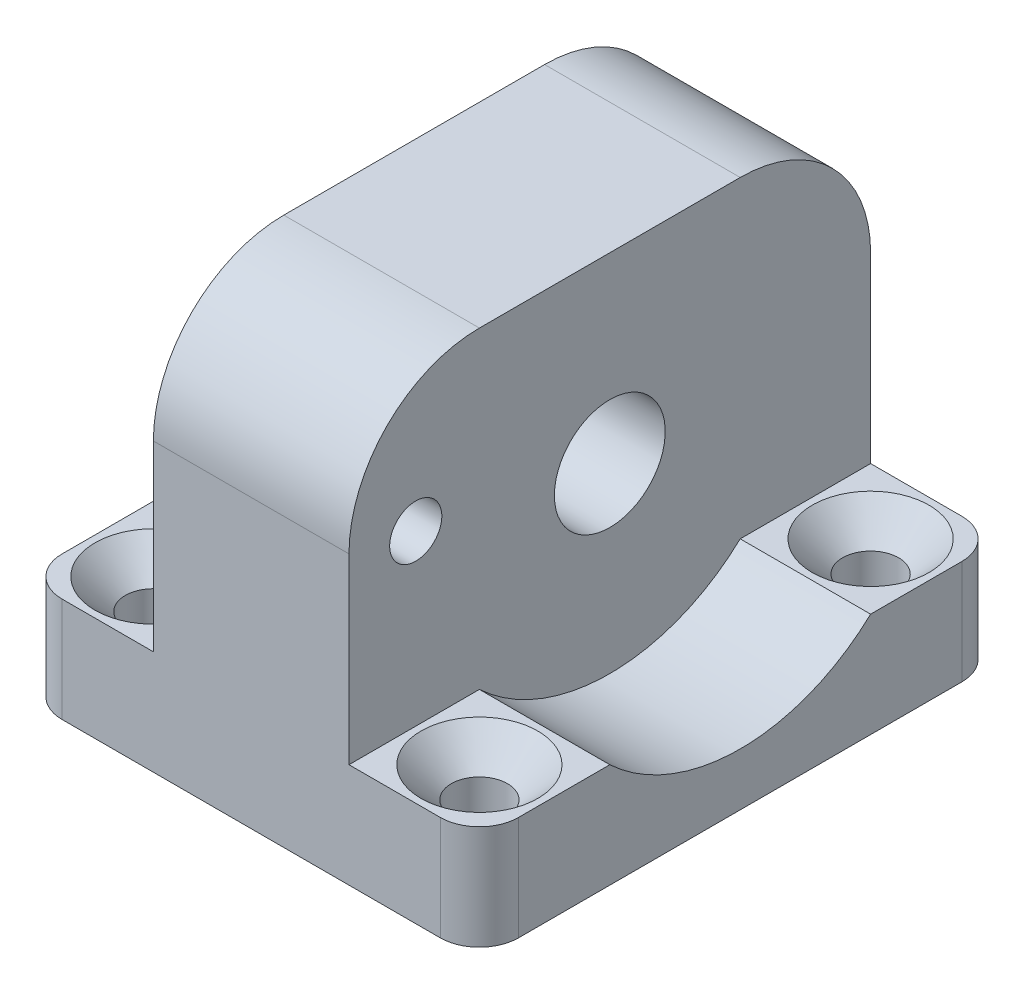
ISO-10303-21;
HEADER;
FILE_DESCRIPTION(('STEP AP214'),'2;1');
FILE_NAME('part.step','',(''),(''),'','','');
FILE_SCHEMA(('AUTOMOTIVE_DESIGN { 1 0 10303 214 1 1 1 1 }'));
ENDSEC;
DATA;
#1=APPLICATION_CONTEXT('core data for automotive mechanical design processes');
#2=APPLICATION_PROTOCOL_DEFINITION('international standard','automotive_design',2000,#1);
#3=PRODUCT_CONTEXT('',#1,'mechanical');
#4=PRODUCT('Part','Part','',(#3));
#5=PRODUCT_RELATED_PRODUCT_CATEGORY('part','',(#4));
#6=PRODUCT_DEFINITION_FORMATION('','',#4);
#7=PRODUCT_DEFINITION_CONTEXT('part definition',#1,'design');
#8=PRODUCT_DEFINITION('design','',#6,#7);
#9=PRODUCT_DEFINITION_SHAPE('','',#8);
#10=(LENGTH_UNIT() NAMED_UNIT(*) SI_UNIT(.MILLI.,.METRE.));
#11=(NAMED_UNIT(*) PLANE_ANGLE_UNIT() SI_UNIT($,.RADIAN.));
#12=(NAMED_UNIT(*) SI_UNIT($,.STERADIAN.) SOLID_ANGLE_UNIT());
#13=UNCERTAINTY_MEASURE_WITH_UNIT(LENGTH_MEASURE(1.E-05),#10,'distance_accuracy_value','');
#14=(GEOMETRIC_REPRESENTATION_CONTEXT(3) GLOBAL_UNCERTAINTY_ASSIGNED_CONTEXT((#13)) GLOBAL_UNIT_ASSIGNED_CONTEXT((#10,
#11,#12)) REPRESENTATION_CONTEXT('',''));
#15=CARTESIAN_POINT('',(0.,0.,0.));
#16=DIRECTION('',(0.,0.,1.));
#17=DIRECTION('',(1.,0.,0.));
#18=AXIS2_PLACEMENT_3D('',#15,#16,#17);
#19=CARTESIAN_POINT('',(0.,8.,0.));
#20=DIRECTION('',(0.,1.,0.));
#21=DIRECTION('',(0.,0.,1.));
#22=AXIS2_PLACEMENT_3D('',#19,#20,#21);
#23=PLANE('',#22);
#24=CARTESIAN_POINT('',(12.5,8.,15.));
#25=DIRECTION('',(0.,1.,0.));
#26=DIRECTION('',(0.,0.,1.));
#27=AXIS2_PLACEMENT_3D('',#24,#25,#26);
#28=CIRCLE('',#27,4.48);
#29=CARTESIAN_POINT('',(12.5,8.,19.48));
#30=VERTEX_POINT('',#29);
#31=EDGE_CURVE('E387',#30,#30,#28,.T.);
#32=ORIENTED_EDGE('',*,*,#31,.F.);
#33=EDGE_LOOP('',(#32));
#34=FACE_BOUND('',#33,.T.);
#35=DIRECTION('',(0.,0.,-1.));
#36=VECTOR('',#35,1.);
#37=CARTESIAN_POINT('',(17.5,8.,-20.));
#38=LINE('',#37,#36);
#39=CARTESIAN_POINT('',(17.5,8.,17.));
#40=VERTEX_POINT('',#39);
#41=CARTESIAN_POINT('',(17.5,8.,10.));
#42=VERTEX_POINT('',#41);
#43=EDGE_CURVE('E181',#40,#42,#38,.T.);
#44=ORIENTED_EDGE('',*,*,#43,.T.);
#45=DIRECTION('',(1.,0.,0.));
#46=VECTOR('',#45,1.);
#47=CARTESIAN_POINT('',(7.5,8.,10.));
#48=LINE('',#47,#46);
#49=CARTESIAN_POINT('',(7.5,8.,10.));
#50=VERTEX_POINT('',#49);
#51=EDGE_CURVE('E167',#50,#42,#48,.T.);
#52=ORIENTED_EDGE('',*,*,#51,.F.);
#53=DIRECTION('',(0.,0.,-1.));
#54=VECTOR('',#53,1.);
#55=CARTESIAN_POINT('',(7.5,8.,-20.));
#56=LINE('',#55,#54);
#57=CARTESIAN_POINT('',(7.5,8.,20.));
#58=VERTEX_POINT('',#57);
#59=EDGE_CURVE('E178',#58,#50,#56,.T.);
#60=ORIENTED_EDGE('',*,*,#59,.F.);
#61=DIRECTION('',(1.,0.,0.));
#62=VECTOR('',#61,1.);
#63=CARTESIAN_POINT('',(-17.5,8.,20.));
#64=LINE('',#63,#62);
#65=CARTESIAN_POINT('',(14.5,8.,20.));
#66=VERTEX_POINT('',#65);
#67=EDGE_CURVE('E254',#58,#66,#64,.T.);
#68=ORIENTED_EDGE('',*,*,#67,.T.);
#69=CARTESIAN_POINT('',(14.5,8.,17.));
#70=DIRECTION('',(0.,1.,0.));
#71=DIRECTION('',(0.,0.,1.));
#72=AXIS2_PLACEMENT_3D('',#69,#70,#71);
#73=CIRCLE('',#72,3.);
#74=EDGE_CURVE('E292',#66,#40,#73,.T.);
#75=ORIENTED_EDGE('',*,*,#74,.T.);
#76=EDGE_LOOP('',(#44,#52,#60,#68,#75));
#77=FACE_BOUND('',#76,.T.);
#78=ADVANCED_FACE('F40',(#34,#77),#23,.T.);
#79=CARTESIAN_POINT('',(12.5,8.,-15.));
#80=DIRECTION('',(0.,1.,0.));
#81=DIRECTION('',(0.,0.,1.));
#82=AXIS2_PLACEMENT_3D('',#79,#80,#81);
#83=CIRCLE('',#82,4.48);
#84=CARTESIAN_POINT('',(12.5,8.,-10.52));
#85=VERTEX_POINT('',#84);
#86=EDGE_CURVE('E378',#85,#85,#83,.T.);
#87=ORIENTED_EDGE('',*,*,#86,.F.);
#88=EDGE_LOOP('',(#87));
#89=FACE_BOUND('',#88,.T.);
#90=CARTESIAN_POINT('',(7.5,8.,-10.));
#91=VERTEX_POINT('',#90);
#92=CARTESIAN_POINT('',(7.5,8.,-20.));
#93=VERTEX_POINT('',#92);
#94=EDGE_CURVE('E44',#91,#93,#56,.T.);
#95=ORIENTED_EDGE('',*,*,#94,.F.);
#96=DIRECTION('',(1.,0.,0.));
#97=VECTOR('',#96,1.);
#98=CARTESIAN_POINT('',(7.5,8.,-10.));
#99=LINE('',#98,#97);
#100=CARTESIAN_POINT('',(17.5,8.,-10.));
#101=VERTEX_POINT('',#100);
#102=EDGE_CURVE('E170',#91,#101,#99,.T.);
#103=ORIENTED_EDGE('',*,*,#102,.T.);
#104=CARTESIAN_POINT('',(17.5,8.,-17.));
#105=VERTEX_POINT('',#104);
#106=EDGE_CURVE('E319',#101,#105,#38,.T.);
#107=ORIENTED_EDGE('',*,*,#106,.T.);
#108=CARTESIAN_POINT('',(14.5,8.,-17.));
#109=DIRECTION('',(0.,1.,0.));
#110=DIRECTION('',(0.,0.,1.));
#111=AXIS2_PLACEMENT_3D('',#108,#109,#110);
#112=CIRCLE('',#111,3.);
#113=CARTESIAN_POINT('',(14.5,8.,-20.));
#114=VERTEX_POINT('',#113);
#115=EDGE_CURVE('E294',#105,#114,#112,.T.);
#116=ORIENTED_EDGE('',*,*,#115,.T.);
#117=DIRECTION('',(-1.,0.,0.));
#118=VECTOR('',#117,1.);
#119=CARTESIAN_POINT('',(-17.5,8.,-20.));
#120=LINE('',#119,#118);
#121=EDGE_CURVE('E266',#114,#93,#120,.T.);
#122=ORIENTED_EDGE('',*,*,#121,.T.);
#123=EDGE_LOOP('',(#95,#103,#107,#116,#122));
#124=FACE_BOUND('',#123,.T.);
#125=ADVANCED_FACE('F335',(#89,#124),#23,.T.);
#126=CARTESIAN_POINT('',(17.5,8.,-20.));
#127=DIRECTION('',(-1.,0.,0.));
#128=DIRECTION('',(0.,0.,1.));
#129=AXIS2_PLACEMENT_3D('',#126,#127,#128);
#130=PLANE('',#129);
#131=CARTESIAN_POINT('',(17.5,18.6661430910927,0.));
#132=DIRECTION('',(-1.,0.,0.));
#133=DIRECTION('',(0.,0.,1.));
#134=AXIS2_PLACEMENT_3D('',#131,#132,#133);
#135=CIRCLE('',#134,14.6207595028324);
#136=EDGE_CURVE('E172',#101,#42,#135,.T.);
#137=ORIENTED_EDGE('',*,*,#136,.T.);
#138=ORIENTED_EDGE('',*,*,#43,.F.);
#139=DIRECTION('',(0.,-1.,0.));
#140=VECTOR('',#139,1.);
#141=CARTESIAN_POINT('',(17.5,8.,17.));
#142=LINE('',#141,#140);
#143=CARTESIAN_POINT('',(17.5,0.,17.));
#144=VERTEX_POINT('',#143);
#145=EDGE_CURVE('E286',#40,#144,#142,.T.);
#146=ORIENTED_EDGE('',*,*,#145,.T.);
#147=DIRECTION('',(0.,0.,-1.));
#148=VECTOR('',#147,1.);
#149=CARTESIAN_POINT('',(17.5,0.,-20.));
#150=LINE('',#149,#148);
#151=CARTESIAN_POINT('',(17.5,0.,-17.));
#152=VERTEX_POINT('',#151);
#153=EDGE_CURVE('E233',#144,#152,#150,.T.);
#154=ORIENTED_EDGE('',*,*,#153,.T.);
#155=DIRECTION('',(0.,-1.,0.));
#156=VECTOR('',#155,1.);
#157=CARTESIAN_POINT('',(17.5,8.,-17.));
#158=LINE('',#157,#156);
#159=EDGE_CURVE('E289',#152,#105,#158,.F.);
#160=ORIENTED_EDGE('',*,*,#159,.T.);
#161=ORIENTED_EDGE('',*,*,#106,.F.);
#162=EDGE_LOOP('',(#137,#138,#146,#154,#160,#161));
#163=FACE_BOUND('',#162,.T.);
#164=ADVANCED_FACE('F326',(#163),#130,.F.);
#165=DIRECTION('',(-1.,0.,0.));
#166=VECTOR('',#165,1.);
#167=CARTESIAN_POINT('',(-7.5,8.,-10.));
#168=LINE('',#167,#166);
#169=CARTESIAN_POINT('',(-7.5,8.,-10.));
#170=VERTEX_POINT('',#169);
#171=CARTESIAN_POINT('',(-17.5,8.,-10.));
#172=VERTEX_POINT('',#171);
#173=EDGE_CURVE('E393',#170,#172,#168,.T.);
#174=ORIENTED_EDGE('',*,*,#173,.F.);
#175=DIRECTION('',(0.,0.,1.));
#176=VECTOR('',#175,1.);
#177=CARTESIAN_POINT('',(-7.5,8.,-20.));
#178=LINE('',#177,#176);
#179=CARTESIAN_POINT('',(-7.5,8.,-20.));
#180=VERTEX_POINT('',#179);
#181=EDGE_CURVE('E190',#180,#170,#178,.T.);
#182=ORIENTED_EDGE('',*,*,#181,.F.);
#183=CARTESIAN_POINT('',(-14.5,8.,-20.));
#184=VERTEX_POINT('',#183);
#185=EDGE_CURVE('E263',#180,#184,#120,.T.);
#186=ORIENTED_EDGE('',*,*,#185,.T.);
#187=CARTESIAN_POINT('',(-14.5,8.,-17.));
#188=DIRECTION('',(0.,1.,0.));
#189=DIRECTION('',(0.,0.,1.));
#190=AXIS2_PLACEMENT_3D('',#187,#188,#189);
#191=CIRCLE('',#190,3.);
#192=CARTESIAN_POINT('',(-17.5,8.,-17.));
#193=VERTEX_POINT('',#192);
#194=EDGE_CURVE('E244',#184,#193,#191,.T.);
#195=ORIENTED_EDGE('',*,*,#194,.T.);
#196=DIRECTION('',(0.,0.,1.));
#197=VECTOR('',#196,1.);
#198=CARTESIAN_POINT('',(-17.5,8.,-20.));
#199=LINE('',#198,#197);
#200=EDGE_CURVE('E259',#193,#172,#199,.T.);
#201=ORIENTED_EDGE('',*,*,#200,.T.);
#202=EDGE_LOOP('',(#174,#182,#186,#195,#201));
#203=FACE_BOUND('',#202,.T.);
#204=CARTESIAN_POINT('',(-12.5,8.,-15.));
#205=DIRECTION('',(0.,1.,0.));
#206=DIRECTION('',(0.,0.,1.));
#207=AXIS2_PLACEMENT_3D('',#204,#205,#206);
#208=CIRCLE('',#207,4.48);
#209=CARTESIAN_POINT('',(-12.5,8.,-10.52));
#210=VERTEX_POINT('',#209);
#211=EDGE_CURVE('E369',#210,#210,#208,.T.);
#212=ORIENTED_EDGE('',*,*,#211,.F.);
#213=EDGE_LOOP('',(#212));
#214=FACE_BOUND('',#213,.T.);
#215=ADVANCED_FACE('F432',(#203,#214),#23,.T.);
#216=CARTESIAN_POINT('',(-17.5,8.,-20.));
#217=DIRECTION('',(0.,0.,1.));
#218=DIRECTION('',(1.,0.,0.));
#219=AXIS2_PLACEMENT_3D('',#216,#217,#218);
#220=PLANE('',#219);
#221=DIRECTION('',(0.,-1.,0.));
#222=VECTOR('',#221,1.);
#223=CARTESIAN_POINT('',(-7.5,32.,-20.));
#224=LINE('',#223,#222);
#225=CARTESIAN_POINT('',(-7.5,22.,-20.));
#226=VERTEX_POINT('',#225);
#227=EDGE_CURVE('E216',#226,#180,#224,.T.);
#228=ORIENTED_EDGE('',*,*,#227,.F.);
#229=DIRECTION('',(-1.,0.,0.));
#230=VECTOR('',#229,1.);
#231=CARTESIAN_POINT('',(7.5,22.,-20.));
#232=LINE('',#231,#230);
#233=CARTESIAN_POINT('',(7.5,22.,-20.));
#234=VERTEX_POINT('',#233);
#235=EDGE_CURVE('E11',#226,#234,#232,.F.);
#236=ORIENTED_EDGE('',*,*,#235,.T.);
#237=DIRECTION('',(0.,-1.,0.));
#238=VECTOR('',#237,1.);
#239=CARTESIAN_POINT('',(7.5,32.,-20.));
#240=LINE('',#239,#238);
#241=EDGE_CURVE('E218',#234,#93,#240,.T.);
#242=ORIENTED_EDGE('',*,*,#241,.T.);
#243=ORIENTED_EDGE('',*,*,#121,.F.);
#244=DIRECTION('',(0.,-1.,0.));
#245=VECTOR('',#244,1.);
#246=CARTESIAN_POINT('',(14.5,8.,-20.));
#247=LINE('',#246,#245);
#248=CARTESIAN_POINT('',(14.5,0.,-20.));
#249=VERTEX_POINT('',#248);
#250=EDGE_CURVE('E275',#114,#249,#247,.T.);
#251=ORIENTED_EDGE('',*,*,#250,.T.);
#252=DIRECTION('',(-1.,0.,0.));
#253=VECTOR('',#252,1.);
#254=CARTESIAN_POINT('',(-17.5,0.,-20.));
#255=LINE('',#254,#253);
#256=CARTESIAN_POINT('',(-14.5,0.,-20.));
#257=VERTEX_POINT('',#256);
#258=EDGE_CURVE('E317',#249,#257,#255,.T.);
#259=ORIENTED_EDGE('',*,*,#258,.T.);
#260=DIRECTION('',(0.,-1.,0.));
#261=VECTOR('',#260,1.);
#262=CARTESIAN_POINT('',(-14.5,8.,-20.));
#263=LINE('',#262,#261);
#264=EDGE_CURVE('E253',#257,#184,#263,.F.);
#265=ORIENTED_EDGE('',*,*,#264,.T.);
#266=ORIENTED_EDGE('',*,*,#185,.F.);
#267=EDGE_LOOP('',(#228,#236,#242,#243,#251,#259,#265,#266));
#268=FACE_BOUND('',#267,.T.);
#269=ADVANCED_FACE('F337',(#268),#220,.F.);
#270=CARTESIAN_POINT('',(-17.5,8.,-20.));
#271=DIRECTION('',(1.,0.,0.));
#272=DIRECTION('',(0.,0.,-1.));
#273=AXIS2_PLACEMENT_3D('',#270,#271,#272);
#274=PLANE('',#273);
#275=CARTESIAN_POINT('',(-17.5,8.,10.));
#276=VERTEX_POINT('',#275);
#277=CARTESIAN_POINT('',(-17.5,8.,17.));
#278=VERTEX_POINT('',#277);
#279=EDGE_CURVE('E273',#276,#278,#199,.T.);
#280=ORIENTED_EDGE('',*,*,#279,.F.);
#281=CARTESIAN_POINT('',(-17.5,18.6661430910927,0.));
#282=DIRECTION('',(-1.,0.,0.));
#283=DIRECTION('',(0.,0.,1.));
#284=AXIS2_PLACEMENT_3D('',#281,#282,#283);
#285=CIRCLE('',#284,14.6207595028324);
#286=EDGE_CURVE('E182',#172,#276,#285,.T.);
#287=ORIENTED_EDGE('',*,*,#286,.F.);
#288=ORIENTED_EDGE('',*,*,#200,.F.);
#289=DIRECTION('',(0.,-1.,0.));
#290=VECTOR('',#289,1.);
#291=CARTESIAN_POINT('',(-17.5,8.,-17.));
#292=LINE('',#291,#290);
#293=CARTESIAN_POINT('',(-17.5,0.,-17.));
#294=VERTEX_POINT('',#293);
#295=EDGE_CURVE('E248',#193,#294,#292,.T.);
#296=ORIENTED_EDGE('',*,*,#295,.T.);
#297=DIRECTION('',(0.,0.,1.));
#298=VECTOR('',#297,1.);
#299=CARTESIAN_POINT('',(-17.5,0.,-20.));
#300=LINE('',#299,#298);
#301=CARTESIAN_POINT('',(-17.5,0.,17.));
#302=VERTEX_POINT('',#301);
#303=EDGE_CURVE('E307',#294,#302,#300,.T.);
#304=ORIENTED_EDGE('',*,*,#303,.T.);
#305=DIRECTION('',(0.,-1.,0.));
#306=VECTOR('',#305,1.);
#307=CARTESIAN_POINT('',(-17.5,8.,17.));
#308=LINE('',#307,#306);
#309=EDGE_CURVE('E295',#302,#278,#308,.F.);
#310=ORIENTED_EDGE('',*,*,#309,.T.);
#311=EDGE_LOOP('',(#280,#287,#288,#296,#304,#310));
#312=FACE_BOUND('',#311,.T.);
#313=ADVANCED_FACE('F306',(#312),#274,.F.);
#314=CARTESIAN_POINT('',(-17.5,8.,20.));
#315=DIRECTION('',(0.,0.,-1.));
#316=DIRECTION('',(-1.,0.,0.));
#317=AXIS2_PLACEMENT_3D('',#314,#315,#316);
#318=PLANE('',#317);
#319=DIRECTION('',(0.,-1.,0.));
#320=VECTOR('',#319,1.);
#321=CARTESIAN_POINT('',(7.5,32.,20.));
#322=LINE('',#321,#320);
#323=CARTESIAN_POINT('',(7.5,22.,20.));
#324=VERTEX_POINT('',#323);
#325=EDGE_CURVE('E187',#324,#58,#322,.T.);
#326=ORIENTED_EDGE('',*,*,#325,.F.);
#327=DIRECTION('',(1.,0.,0.));
#328=VECTOR('',#327,1.);
#329=CARTESIAN_POINT('',(-7.5,22.,20.));
#330=LINE('',#329,#328);
#331=CARTESIAN_POINT('',(-7.5,22.,20.));
#332=VERTEX_POINT('',#331);
#333=EDGE_CURVE('E215',#324,#332,#330,.F.);
#334=ORIENTED_EDGE('',*,*,#333,.T.);
#335=DIRECTION('',(0.,-1.,0.));
#336=VECTOR('',#335,1.);
#337=CARTESIAN_POINT('',(-7.5,32.,20.));
#338=LINE('',#337,#336);
#339=CARTESIAN_POINT('',(-7.5,8.,20.));
#340=VERTEX_POINT('',#339);
#341=EDGE_CURVE('E219',#332,#340,#338,.T.);
#342=ORIENTED_EDGE('',*,*,#341,.T.);
#343=CARTESIAN_POINT('',(-14.5,8.,20.));
#344=VERTEX_POINT('',#343);
#345=EDGE_CURVE('E249',#344,#340,#64,.T.);
#346=ORIENTED_EDGE('',*,*,#345,.F.);
#347=DIRECTION('',(0.,-1.,0.));
#348=VECTOR('',#347,1.);
#349=CARTESIAN_POINT('',(-14.5,8.,20.));
#350=LINE('',#349,#348);
#351=CARTESIAN_POINT('',(-14.5,0.,20.));
#352=VERTEX_POINT('',#351);
#353=EDGE_CURVE('E239',#344,#352,#350,.T.);
#354=ORIENTED_EDGE('',*,*,#353,.T.);
#355=DIRECTION('',(1.,0.,0.));
#356=VECTOR('',#355,1.);
#357=CARTESIAN_POINT('',(-17.5,0.,20.));
#358=LINE('',#357,#356);
#359=CARTESIAN_POINT('',(14.5,0.,20.));
#360=VERTEX_POINT('',#359);
#361=EDGE_CURVE('E267',#352,#360,#358,.T.);
#362=ORIENTED_EDGE('',*,*,#361,.T.);
#363=DIRECTION('',(0.,-1.,0.));
#364=VECTOR('',#363,1.);
#365=CARTESIAN_POINT('',(14.5,8.,20.));
#366=LINE('',#365,#364);
#367=EDGE_CURVE('E242',#360,#66,#366,.F.);
#368=ORIENTED_EDGE('',*,*,#367,.T.);
#369=ORIENTED_EDGE('',*,*,#67,.F.);
#370=EDGE_LOOP('',(#326,#334,#342,#346,#354,#362,#368,#369));
#371=FACE_BOUND('',#370,.T.);
#372=ADVANCED_FACE('F436',(#371),#318,.F.);
#373=DIRECTION('',(-1.,0.,0.));
#374=VECTOR('',#373,1.);
#375=CARTESIAN_POINT('',(-7.5,8.,10.));
#376=LINE('',#375,#374);
#377=CARTESIAN_POINT('',(-7.5,8.,9.99999999999999));
#378=VERTEX_POINT('',#377);
#379=EDGE_CURVE('E394',#378,#276,#376,.T.);
#380=ORIENTED_EDGE('',*,*,#379,.T.);
#381=ORIENTED_EDGE('',*,*,#279,.T.);
#382=CARTESIAN_POINT('',(-14.5,8.,17.));
#383=DIRECTION('',(0.,1.,0.));
#384=DIRECTION('',(0.,0.,1.));
#385=AXIS2_PLACEMENT_3D('',#382,#383,#384);
#386=CIRCLE('',#385,3.);
#387=EDGE_CURVE('E246',#278,#344,#386,.T.);
#388=ORIENTED_EDGE('',*,*,#387,.T.);
#389=ORIENTED_EDGE('',*,*,#345,.T.);
#390=EDGE_CURVE('E188',#378,#340,#178,.T.);
#391=ORIENTED_EDGE('',*,*,#390,.F.);
#392=EDGE_LOOP('',(#380,#381,#388,#389,#391));
#393=FACE_BOUND('',#392,.T.);
#394=CARTESIAN_POINT('',(-12.5,8.,15.));
#395=DIRECTION('',(0.,1.,0.));
#396=DIRECTION('',(0.,0.,1.));
#397=AXIS2_PLACEMENT_3D('',#394,#395,#396);
#398=CIRCLE('',#397,4.48);
#399=CARTESIAN_POINT('',(-12.5,8.,19.48));
#400=VERTEX_POINT('',#399);
#401=EDGE_CURVE('E360',#400,#400,#398,.T.);
#402=ORIENTED_EDGE('',*,*,#401,.F.);
#403=EDGE_LOOP('',(#402));
#404=FACE_BOUND('',#403,.T.);
#405=ADVANCED_FACE('F427',(#393,#404),#23,.T.);
#406=CARTESIAN_POINT('',(0.,0.,0.));
#407=DIRECTION('',(0.,1.,0.));
#408=DIRECTION('',(0.,0.,1.));
#409=AXIS2_PLACEMENT_3D('',#406,#407,#408);
#410=PLANE('',#409);
#411=CARTESIAN_POINT('',(12.5,0.,15.));
#412=DIRECTION('',(0.,1.,0.));
#413=DIRECTION('',(0.,0.,1.));
#414=AXIS2_PLACEMENT_3D('',#411,#412,#413);
#415=CIRCLE('',#414,2.15);
#416=CARTESIAN_POINT('',(12.5,0.,17.15));
#417=VERTEX_POINT('',#416);
#418=EDGE_CURVE('E381',#417,#417,#415,.T.);
#419=ORIENTED_EDGE('',*,*,#418,.T.);
#420=EDGE_LOOP('',(#419));
#421=FACE_BOUND('',#420,.T.);
#422=CARTESIAN_POINT('',(12.5,0.,-15.));
#423=DIRECTION('',(0.,1.,0.));
#424=DIRECTION('',(0.,0.,1.));
#425=AXIS2_PLACEMENT_3D('',#422,#423,#424);
#426=CIRCLE('',#425,2.15);
#427=CARTESIAN_POINT('',(12.5,0.,-12.85));
#428=VERTEX_POINT('',#427);
#429=EDGE_CURVE('E372',#428,#428,#426,.T.);
#430=ORIENTED_EDGE('',*,*,#429,.T.);
#431=EDGE_LOOP('',(#430));
#432=FACE_BOUND('',#431,.T.);
#433=CARTESIAN_POINT('',(-12.5,0.,-15.));
#434=DIRECTION('',(0.,1.,0.));
#435=DIRECTION('',(0.,0.,1.));
#436=AXIS2_PLACEMENT_3D('',#433,#434,#435);
#437=CIRCLE('',#436,2.15);
#438=CARTESIAN_POINT('',(-12.5,0.,-12.85));
#439=VERTEX_POINT('',#438);
#440=EDGE_CURVE('E363',#439,#439,#437,.T.);
#441=ORIENTED_EDGE('',*,*,#440,.T.);
#442=EDGE_LOOP('',(#441));
#443=FACE_BOUND('',#442,.T.);
#444=CARTESIAN_POINT('',(-12.5,0.,15.));
#445=DIRECTION('',(0.,1.,0.));
#446=DIRECTION('',(0.,0.,1.));
#447=AXIS2_PLACEMENT_3D('',#444,#445,#446);
#448=CIRCLE('',#447,2.15);
#449=CARTESIAN_POINT('',(-12.5,0.,17.15));
#450=VERTEX_POINT('',#449);
#451=EDGE_CURVE('E191',#450,#450,#448,.T.);
#452=ORIENTED_EDGE('',*,*,#451,.T.);
#453=EDGE_LOOP('',(#452));
#454=FACE_BOUND('',#453,.T.);
#455=ORIENTED_EDGE('',*,*,#258,.F.);
#456=CARTESIAN_POINT('',(14.5,0.,-17.));
#457=DIRECTION('',(0.,1.,0.));
#458=DIRECTION('',(0.,0.,1.));
#459=AXIS2_PLACEMENT_3D('',#456,#457,#458);
#460=CIRCLE('',#459,3.);
#461=EDGE_CURVE('E284',#249,#152,#460,.F.);
#462=ORIENTED_EDGE('',*,*,#461,.T.);
#463=ORIENTED_EDGE('',*,*,#153,.F.);
#464=CARTESIAN_POINT('',(14.5,0.,17.));
#465=DIRECTION('',(0.,1.,0.));
#466=DIRECTION('',(0.,0.,1.));
#467=AXIS2_PLACEMENT_3D('',#464,#465,#466);
#468=CIRCLE('',#467,3.);
#469=EDGE_CURVE('E278',#144,#360,#468,.F.);
#470=ORIENTED_EDGE('',*,*,#469,.T.);
#471=ORIENTED_EDGE('',*,*,#361,.F.);
#472=CARTESIAN_POINT('',(-14.5,0.,17.));
#473=DIRECTION('',(0.,1.,0.));
#474=DIRECTION('',(0.,0.,1.));
#475=AXIS2_PLACEMENT_3D('',#472,#473,#474);
#476=CIRCLE('',#475,3.);
#477=EDGE_CURVE('E280',#352,#302,#476,.F.);
#478=ORIENTED_EDGE('',*,*,#477,.T.);
#479=ORIENTED_EDGE('',*,*,#303,.F.);
#480=CARTESIAN_POINT('',(-14.5,0.,-17.));
#481=DIRECTION('',(0.,1.,0.));
#482=DIRECTION('',(0.,0.,1.));
#483=AXIS2_PLACEMENT_3D('',#480,#481,#482);
#484=CIRCLE('',#483,3.);
#485=EDGE_CURVE('E282',#294,#257,#484,.F.);
#486=ORIENTED_EDGE('',*,*,#485,.T.);
#487=EDGE_LOOP('',(#455,#462,#463,#470,#471,#478,#479,#486));
#488=FACE_BOUND('',#487,.T.);
#489=ADVANCED_FACE('F314',(#421,#432,#443,#454,#488),#410,.F.);
#490=CARTESIAN_POINT('',(7.5,32.,-20.));
#491=DIRECTION('',(-1.,0.,0.));
#492=DIRECTION('',(0.,0.,1.));
#493=AXIS2_PLACEMENT_3D('',#490,#491,#492);
#494=PLANE('',#493);
#495=CARTESIAN_POINT('',(7.5,20.9575308997216,14.8830323358084));
#496=DIRECTION('',(-1.,0.,0.));
#497=DIRECTION('',(0.,0.,1.));
#498=AXIS2_PLACEMENT_3D('',#495,#496,#497);
#499=CIRCLE('',#498,2.);
#500=CARTESIAN_POINT('',(7.5,20.9575308997216,16.8830323358084));
#501=VERTEX_POINT('',#500);
#502=EDGE_CURVE('E405',#501,#501,#499,.T.);
#503=ORIENTED_EDGE('',*,*,#502,.T.);
#504=EDGE_LOOP('',(#503));
#505=FACE_BOUND('',#504,.T.);
#506=CARTESIAN_POINT('',(7.5,18.,0.));
#507=DIRECTION('',(-1.,0.,0.));
#508=DIRECTION('',(0.,0.,1.));
#509=AXIS2_PLACEMENT_3D('',#506,#507,#508);
#510=CIRCLE('',#509,4.25);
#511=CARTESIAN_POINT('',(7.5,18.,4.25));
#512=VERTEX_POINT('',#511);
#513=EDGE_CURVE('E390',#512,#512,#510,.T.);
#514=ORIENTED_EDGE('',*,*,#513,.T.);
#515=EDGE_LOOP('',(#514));
#516=FACE_BOUND('',#515,.T.);
#517=DIRECTION('',(0.,0.,-1.));
#518=VECTOR('',#517,1.);
#519=CARTESIAN_POINT('',(7.5,32.,-20.));
#520=LINE('',#519,#518);
#521=CARTESIAN_POINT('',(7.5,32.,10.));
#522=VERTEX_POINT('',#521);
#523=CARTESIAN_POINT('',(7.5,32.,-10.));
#524=VERTEX_POINT('',#523);
#525=EDGE_CURVE('E349',#522,#524,#520,.T.);
#526=ORIENTED_EDGE('',*,*,#525,.F.);
#527=CARTESIAN_POINT('',(7.5,22.,10.));
#528=DIRECTION('',(-1.,0.,0.));
#529=DIRECTION('',(0.,0.,1.));
#530=AXIS2_PLACEMENT_3D('',#527,#528,#529);
#531=CIRCLE('',#530,10.);
#532=EDGE_CURVE('E225',#522,#324,#531,.F.);
#533=ORIENTED_EDGE('',*,*,#532,.T.);
#534=ORIENTED_EDGE('',*,*,#325,.T.);
#535=ORIENTED_EDGE('',*,*,#59,.T.);
#536=CARTESIAN_POINT('',(7.5,18.6661430910927,0.));
#537=DIRECTION('',(-1.,0.,0.));
#538=DIRECTION('',(0.,0.,1.));
#539=AXIS2_PLACEMENT_3D('',#536,#537,#538);
#540=CIRCLE('',#539,14.6207595028324);
#541=EDGE_CURVE('E58',#91,#50,#540,.T.);
#542=ORIENTED_EDGE('',*,*,#541,.F.);
#543=ORIENTED_EDGE('',*,*,#94,.T.);
#544=ORIENTED_EDGE('',*,*,#241,.F.);
#545=CARTESIAN_POINT('',(7.5,22.,-9.99999999999999));
#546=DIRECTION('',(-1.,0.,0.));
#547=DIRECTION('',(0.,0.,1.));
#548=AXIS2_PLACEMENT_3D('',#545,#546,#547);
#549=CIRCLE('',#548,10.);
#550=EDGE_CURVE('E227',#234,#524,#549,.F.);
#551=ORIENTED_EDGE('',*,*,#550,.T.);
#552=EDGE_LOOP('',(#526,#533,#534,#535,#542,#543,#544,#551));
#553=FACE_BOUND('',#552,.T.);
#554=ADVANCED_FACE('F185',(#505,#516,#553),#494,.F.);
#555=CARTESIAN_POINT('',(-7.5,32.,-20.));
#556=DIRECTION('',(1.,0.,0.));
#557=DIRECTION('',(0.,0.,-1.));
#558=AXIS2_PLACEMENT_3D('',#555,#556,#557);
#559=PLANE('',#558);
#560=CARTESIAN_POINT('',(-7.5,20.9575308997216,14.8830323358084));
#561=DIRECTION('',(-1.,0.,0.));
#562=DIRECTION('',(0.,0.,1.));
#563=AXIS2_PLACEMENT_3D('',#560,#561,#562);
#564=CIRCLE('',#563,2.);
#565=CARTESIAN_POINT('',(-7.5,20.9575308997216,16.8830323358084));
#566=VERTEX_POINT('',#565);
#567=EDGE_CURVE('E408',#566,#566,#564,.T.);
#568=ORIENTED_EDGE('',*,*,#567,.F.);
#569=EDGE_LOOP('',(#568));
#570=FACE_BOUND('',#569,.T.);
#571=ORIENTED_EDGE('',*,*,#341,.F.);
#572=CARTESIAN_POINT('',(-7.5,22.,10.));
#573=DIRECTION('',(1.,0.,0.));
#574=DIRECTION('',(0.,0.,-1.));
#575=AXIS2_PLACEMENT_3D('',#572,#573,#574);
#576=CIRCLE('',#575,10.);
#577=CARTESIAN_POINT('',(-7.5,32.,10.));
#578=VERTEX_POINT('',#577);
#579=EDGE_CURVE('E50',#332,#578,#576,.F.);
#580=ORIENTED_EDGE('',*,*,#579,.T.);
#581=DIRECTION('',(0.,0.,1.));
#582=VECTOR('',#581,1.);
#583=CARTESIAN_POINT('',(-7.5,32.,-20.));
#584=LINE('',#583,#582);
#585=CARTESIAN_POINT('',(-7.5,32.,-10.));
#586=VERTEX_POINT('',#585);
#587=EDGE_CURVE('E201',#586,#578,#584,.T.);
#588=ORIENTED_EDGE('',*,*,#587,.F.);
#589=CARTESIAN_POINT('',(-7.5,22.,-9.99999999999999));
#590=DIRECTION('',(1.,0.,0.));
#591=DIRECTION('',(0.,0.,-1.));
#592=AXIS2_PLACEMENT_3D('',#589,#590,#591);
#593=CIRCLE('',#592,10.);
#594=EDGE_CURVE('E213',#586,#226,#593,.F.);
#595=ORIENTED_EDGE('',*,*,#594,.T.);
#596=ORIENTED_EDGE('',*,*,#227,.T.);
#597=ORIENTED_EDGE('',*,*,#181,.T.);
#598=CARTESIAN_POINT('',(-7.5,18.6661430910927,0.));
#599=DIRECTION('',(-1.,0.,0.));
#600=DIRECTION('',(0.,0.,1.));
#601=AXIS2_PLACEMENT_3D('',#598,#599,#600);
#602=CIRCLE('',#601,14.6207595028324);
#603=EDGE_CURVE('E66',#170,#378,#602,.T.);
#604=ORIENTED_EDGE('',*,*,#603,.T.);
#605=ORIENTED_EDGE('',*,*,#390,.T.);
#606=EDGE_LOOP('',(#571,#580,#588,#595,#596,#597,#604,#605));
#607=FACE_BOUND('',#606,.T.);
#608=CARTESIAN_POINT('',(-7.5,18.,0.));
#609=DIRECTION('',(1.,0.,0.));
#610=DIRECTION('',(0.,0.,-1.));
#611=AXIS2_PLACEMENT_3D('',#608,#609,#610);
#612=CIRCLE('',#611,4.25);
#613=CARTESIAN_POINT('',(-7.5,18.,-4.25));
#614=VERTEX_POINT('',#613);
#615=EDGE_CURVE('E401',#614,#614,#612,.T.);
#616=ORIENTED_EDGE('',*,*,#615,.T.);
#617=EDGE_LOOP('',(#616));
#618=FACE_BOUND('',#617,.T.);
#619=ADVANCED_FACE('F351',(#570,#607,#618),#559,.F.);
#620=CARTESIAN_POINT('',(0.,32.,0.));
#621=DIRECTION('',(0.,1.,0.));
#622=DIRECTION('',(0.,0.,1.));
#623=AXIS2_PLACEMENT_3D('',#620,#621,#622);
#624=PLANE('',#623);
#625=ORIENTED_EDGE('',*,*,#587,.T.);
#626=DIRECTION('',(1.,0.,0.));
#627=VECTOR('',#626,1.);
#628=CARTESIAN_POINT('',(7.5,32.,10.));
#629=LINE('',#628,#627);
#630=EDGE_CURVE('E229',#578,#522,#629,.T.);
#631=ORIENTED_EDGE('',*,*,#630,.T.);
#632=ORIENTED_EDGE('',*,*,#525,.T.);
#633=DIRECTION('',(-1.,0.,0.));
#634=VECTOR('',#633,1.);
#635=CARTESIAN_POINT('',(-7.5,32.,-9.99999999999999));
#636=LINE('',#635,#634);
#637=EDGE_CURVE('E236',#524,#586,#636,.T.);
#638=ORIENTED_EDGE('',*,*,#637,.T.);
#639=EDGE_LOOP('',(#625,#631,#632,#638));
#640=FACE_BOUND('',#639,.T.);
#641=ADVANCED_FACE('F347',(#640),#624,.T.);
#642=CARTESIAN_POINT('',(14.5,8.,-17.));
#643=DIRECTION('',(0.,-1.,0.));
#644=DIRECTION('',(0.,0.,-1.));
#645=AXIS2_PLACEMENT_3D('',#642,#643,#644);
#646=CYLINDRICAL_SURFACE('',#645,3.);
#647=ORIENTED_EDGE('',*,*,#115,.F.);
#648=ORIENTED_EDGE('',*,*,#159,.F.);
#649=ORIENTED_EDGE('',*,*,#461,.F.);
#650=ORIENTED_EDGE('',*,*,#250,.F.);
#651=EDGE_LOOP('',(#647,#648,#649,#650));
#652=FACE_BOUND('',#651,.T.);
#653=ADVANCED_FACE('F331',(#652),#646,.T.);
#654=CARTESIAN_POINT('',(-14.5,8.,-17.));
#655=DIRECTION('',(0.,-1.,0.));
#656=DIRECTION('',(0.,0.,-1.));
#657=AXIS2_PLACEMENT_3D('',#654,#655,#656);
#658=CYLINDRICAL_SURFACE('',#657,3.);
#659=ORIENTED_EDGE('',*,*,#194,.F.);
#660=ORIENTED_EDGE('',*,*,#264,.F.);
#661=ORIENTED_EDGE('',*,*,#485,.F.);
#662=ORIENTED_EDGE('',*,*,#295,.F.);
#663=EDGE_LOOP('',(#659,#660,#661,#662));
#664=FACE_BOUND('',#663,.T.);
#665=ADVANCED_FACE('F508',(#664),#658,.T.);
#666=CARTESIAN_POINT('',(-14.5,8.,17.));
#667=DIRECTION('',(0.,-1.,0.));
#668=DIRECTION('',(0.,0.,-1.));
#669=AXIS2_PLACEMENT_3D('',#666,#667,#668);
#670=CYLINDRICAL_SURFACE('',#669,3.);
#671=ORIENTED_EDGE('',*,*,#387,.F.);
#672=ORIENTED_EDGE('',*,*,#309,.F.);
#673=ORIENTED_EDGE('',*,*,#477,.F.);
#674=ORIENTED_EDGE('',*,*,#353,.F.);
#675=EDGE_LOOP('',(#671,#672,#673,#674));
#676=FACE_BOUND('',#675,.T.);
#677=ADVANCED_FACE('F502',(#676),#670,.T.);
#678=CARTESIAN_POINT('',(14.5,8.,17.));
#679=DIRECTION('',(0.,-1.,0.));
#680=DIRECTION('',(0.,0.,-1.));
#681=AXIS2_PLACEMENT_3D('',#678,#679,#680);
#682=CYLINDRICAL_SURFACE('',#681,3.);
#683=ORIENTED_EDGE('',*,*,#74,.F.);
#684=ORIENTED_EDGE('',*,*,#367,.F.);
#685=ORIENTED_EDGE('',*,*,#469,.F.);
#686=ORIENTED_EDGE('',*,*,#145,.F.);
#687=EDGE_LOOP('',(#683,#684,#685,#686));
#688=FACE_BOUND('',#687,.T.);
#689=ADVANCED_FACE('F497',(#688),#682,.T.);
#690=CARTESIAN_POINT('',(0.,22.,10.));
#691=DIRECTION('',(-1.,0.,0.));
#692=DIRECTION('',(0.,0.,1.));
#693=AXIS2_PLACEMENT_3D('',#690,#691,#692);
#694=CYLINDRICAL_SURFACE('',#693,10.);
#695=ORIENTED_EDGE('',*,*,#579,.F.);
#696=ORIENTED_EDGE('',*,*,#333,.F.);
#697=ORIENTED_EDGE('',*,*,#532,.F.);
#698=ORIENTED_EDGE('',*,*,#630,.F.);
#699=EDGE_LOOP('',(#695,#696,#697,#698));
#700=FACE_BOUND('',#699,.T.);
#701=ADVANCED_FACE('F487',(#700),#694,.T.);
#702=CARTESIAN_POINT('',(0.,22.,-9.99999999999999));
#703=DIRECTION('',(1.,0.,0.));
#704=DIRECTION('',(0.,0.,-1.));
#705=AXIS2_PLACEMENT_3D('',#702,#703,#704);
#706=CYLINDRICAL_SURFACE('',#705,10.);
#707=ORIENTED_EDGE('',*,*,#550,.F.);
#708=ORIENTED_EDGE('',*,*,#235,.F.);
#709=ORIENTED_EDGE('',*,*,#594,.F.);
#710=ORIENTED_EDGE('',*,*,#637,.F.);
#711=EDGE_LOOP('',(#707,#708,#709,#710));
#712=FACE_BOUND('',#711,.T.);
#713=ADVANCED_FACE('F42',(#712),#706,.T.);
#714=CARTESIAN_POINT('',(-12.5,8.,15.));
#715=DIRECTION('',(0.,1.,0.));
#716=DIRECTION('',(0.,0.,1.));
#717=AXIS2_PLACEMENT_3D('',#714,#715,#716);
#718=CYLINDRICAL_SURFACE('',#717,2.15);
#719=ORIENTED_EDGE('',*,*,#451,.F.);
#720=EDGE_LOOP('',(#719));
#721=FACE_BOUND('',#720,.T.);
#722=CARTESIAN_POINT('',(-12.5,5.67,15.));
#723=DIRECTION('',(0.,1.,0.));
#724=DIRECTION('',(0.,0.,1.));
#725=AXIS2_PLACEMENT_3D('',#722,#723,#724);
#726=CIRCLE('',#725,2.15);
#727=CARTESIAN_POINT('',(-12.5,5.67,17.15));
#728=VERTEX_POINT('',#727);
#729=EDGE_CURVE('E357',#728,#728,#726,.T.);
#730=ORIENTED_EDGE('',*,*,#729,.T.);
#731=EDGE_LOOP('',(#730));
#732=FACE_BOUND('',#731,.T.);
#733=ADVANCED_FACE('F480',(#721,#732),#718,.F.);
#734=CARTESIAN_POINT('',(-12.5,8.,15.));
#735=DIRECTION('',(0.,1.,0.));
#736=DIRECTION('',(0.,0.,1.));
#737=AXIS2_PLACEMENT_3D('',#734,#735,#736);
#738=CONICAL_SURFACE('',#737,4.48,0.785398163397449);
#739=ORIENTED_EDGE('',*,*,#729,.F.);
#740=EDGE_LOOP('',(#739));
#741=FACE_BOUND('',#740,.T.);
#742=ORIENTED_EDGE('',*,*,#401,.T.);
#743=EDGE_LOOP('',(#742));
#744=FACE_BOUND('',#743,.T.);
#745=ADVANCED_FACE('F472',(#741,#744),#738,.F.);
#746=CARTESIAN_POINT('',(-12.5,8.,-15.));
#747=DIRECTION('',(0.,1.,0.));
#748=DIRECTION('',(0.,0.,1.));
#749=AXIS2_PLACEMENT_3D('',#746,#747,#748);
#750=CYLINDRICAL_SURFACE('',#749,2.15);
#751=ORIENTED_EDGE('',*,*,#440,.F.);
#752=EDGE_LOOP('',(#751));
#753=FACE_BOUND('',#752,.T.);
#754=CARTESIAN_POINT('',(-12.5,5.67,-15.));
#755=DIRECTION('',(0.,1.,0.));
#756=DIRECTION('',(0.,0.,1.));
#757=AXIS2_PLACEMENT_3D('',#754,#755,#756);
#758=CIRCLE('',#757,2.15);
#759=CARTESIAN_POINT('',(-12.5,5.67,-12.85));
#760=VERTEX_POINT('',#759);
#761=EDGE_CURVE('E366',#760,#760,#758,.T.);
#762=ORIENTED_EDGE('',*,*,#761,.T.);
#763=EDGE_LOOP('',(#762));
#764=FACE_BOUND('',#763,.T.);
#765=ADVANCED_FACE('F462',(#753,#764),#750,.F.);
#766=CARTESIAN_POINT('',(-12.5,8.,-15.));
#767=DIRECTION('',(0.,1.,0.));
#768=DIRECTION('',(0.,0.,1.));
#769=AXIS2_PLACEMENT_3D('',#766,#767,#768);
#770=CONICAL_SURFACE('',#769,4.48,0.785398163397449);
#771=ORIENTED_EDGE('',*,*,#761,.F.);
#772=EDGE_LOOP('',(#771));
#773=FACE_BOUND('',#772,.T.);
#774=ORIENTED_EDGE('',*,*,#211,.T.);
#775=EDGE_LOOP('',(#774));
#776=FACE_BOUND('',#775,.T.);
#777=ADVANCED_FACE('F459',(#773,#776),#770,.F.);
#778=CARTESIAN_POINT('',(12.5,8.,-15.));
#779=DIRECTION('',(0.,1.,0.));
#780=DIRECTION('',(0.,0.,1.));
#781=AXIS2_PLACEMENT_3D('',#778,#779,#780);
#782=CYLINDRICAL_SURFACE('',#781,2.15);
#783=ORIENTED_EDGE('',*,*,#429,.F.);
#784=EDGE_LOOP('',(#783));
#785=FACE_BOUND('',#784,.T.);
#786=CARTESIAN_POINT('',(12.5,5.67,-15.));
#787=DIRECTION('',(0.,1.,0.));
#788=DIRECTION('',(0.,0.,1.));
#789=AXIS2_PLACEMENT_3D('',#786,#787,#788);
#790=CIRCLE('',#789,2.15);
#791=CARTESIAN_POINT('',(12.5,5.67,-12.85));
#792=VERTEX_POINT('',#791);
#793=EDGE_CURVE('E375',#792,#792,#790,.T.);
#794=ORIENTED_EDGE('',*,*,#793,.T.);
#795=EDGE_LOOP('',(#794));
#796=FACE_BOUND('',#795,.T.);
#797=ADVANCED_FACE('F461',(#785,#796),#782,.F.);
#798=CARTESIAN_POINT('',(12.5,8.,-15.));
#799=DIRECTION('',(0.,1.,0.));
#800=DIRECTION('',(0.,0.,1.));
#801=AXIS2_PLACEMENT_3D('',#798,#799,#800);
#802=CONICAL_SURFACE('',#801,4.48,0.785398163397449);
#803=ORIENTED_EDGE('',*,*,#793,.F.);
#804=EDGE_LOOP('',(#803));
#805=FACE_BOUND('',#804,.T.);
#806=ORIENTED_EDGE('',*,*,#86,.T.);
#807=EDGE_LOOP('',(#806));
#808=FACE_BOUND('',#807,.T.);
#809=ADVANCED_FACE('F469',(#805,#808),#802,.F.);
#810=CARTESIAN_POINT('',(12.5,8.,15.));
#811=DIRECTION('',(0.,1.,0.));
#812=DIRECTION('',(0.,0.,1.));
#813=AXIS2_PLACEMENT_3D('',#810,#811,#812);
#814=CYLINDRICAL_SURFACE('',#813,2.15);
#815=ORIENTED_EDGE('',*,*,#418,.F.);
#816=EDGE_LOOP('',(#815));
#817=FACE_BOUND('',#816,.T.);
#818=CARTESIAN_POINT('',(12.5,5.67,15.));
#819=DIRECTION('',(0.,1.,0.));
#820=DIRECTION('',(0.,0.,1.));
#821=AXIS2_PLACEMENT_3D('',#818,#819,#820);
#822=CIRCLE('',#821,2.15);
#823=CARTESIAN_POINT('',(12.5,5.67,17.15));
#824=VERTEX_POINT('',#823);
#825=EDGE_CURVE('E384',#824,#824,#822,.T.);
#826=ORIENTED_EDGE('',*,*,#825,.T.);
#827=EDGE_LOOP('',(#826));
#828=FACE_BOUND('',#827,.T.);
#829=ADVANCED_FACE('F587',(#817,#828),#814,.F.);
#830=CARTESIAN_POINT('',(12.5,8.,15.));
#831=DIRECTION('',(0.,1.,0.));
#832=DIRECTION('',(0.,0.,1.));
#833=AXIS2_PLACEMENT_3D('',#830,#831,#832);
#834=CONICAL_SURFACE('',#833,4.48,0.785398163397449);
#835=ORIENTED_EDGE('',*,*,#825,.F.);
#836=EDGE_LOOP('',(#835));
#837=FACE_BOUND('',#836,.T.);
#838=ORIENTED_EDGE('',*,*,#31,.T.);
#839=EDGE_LOOP('',(#838));
#840=FACE_BOUND('',#839,.T.);
#841=ADVANCED_FACE('F596',(#837,#840),#834,.F.);
#842=CARTESIAN_POINT('',(7.5,18.,0.));
#843=DIRECTION('',(-1.,0.,0.));
#844=DIRECTION('',(0.,0.,1.));
#845=AXIS2_PLACEMENT_3D('',#842,#843,#844);
#846=CYLINDRICAL_SURFACE('',#845,4.25);
#847=ORIENTED_EDGE('',*,*,#513,.F.);
#848=EDGE_LOOP('',(#847));
#849=FACE_BOUND('',#848,.T.);
#850=ORIENTED_EDGE('',*,*,#615,.F.);
#851=EDGE_LOOP('',(#850));
#852=FACE_BOUND('',#851,.T.);
#853=ADVANCED_FACE('F605',(#849,#852),#846,.F.);
#854=CARTESIAN_POINT('',(-7.5,18.6661430910927,0.));
#855=DIRECTION('',(-1.,0.,0.));
#856=DIRECTION('',(0.,0.,1.));
#857=AXIS2_PLACEMENT_3D('',#854,#855,#856);
#858=CYLINDRICAL_SURFACE('',#857,14.6207595028324);
#859=ORIENTED_EDGE('',*,*,#286,.T.);
#860=ORIENTED_EDGE('',*,*,#379,.F.);
#861=ORIENTED_EDGE('',*,*,#603,.F.);
#862=ORIENTED_EDGE('',*,*,#173,.T.);
#863=EDGE_LOOP('',(#859,#860,#861,#862));
#864=FACE_BOUND('',#863,.T.);
#865=ADVANCED_FACE('F631',(#864),#858,.F.);
#866=CARTESIAN_POINT('',(7.5,18.6661430910927,0.));
#867=DIRECTION('',(1.,0.,0.));
#868=DIRECTION('',(0.,0.,-1.));
#869=AXIS2_PLACEMENT_3D('',#866,#867,#868);
#870=CYLINDRICAL_SURFACE('',#869,14.6207595028324);
#871=ORIENTED_EDGE('',*,*,#136,.F.);
#872=ORIENTED_EDGE('',*,*,#102,.F.);
#873=ORIENTED_EDGE('',*,*,#541,.T.);
#874=ORIENTED_EDGE('',*,*,#51,.T.);
#875=EDGE_LOOP('',(#871,#872,#873,#874));
#876=FACE_BOUND('',#875,.T.);
#877=ADVANCED_FACE('F166',(#876),#870,.F.);
#878=CARTESIAN_POINT('',(14.5,20.9575308997216,14.8830323358084));
#879=DIRECTION('',(-1.,0.,0.));
#880=DIRECTION('',(0.,0.,1.));
#881=AXIS2_PLACEMENT_3D('',#878,#879,#880);
#882=CYLINDRICAL_SURFACE('',#881,2.);
#883=ORIENTED_EDGE('',*,*,#567,.T.);
#884=EDGE_LOOP('',(#883));
#885=FACE_BOUND('',#884,.T.);
#886=ORIENTED_EDGE('',*,*,#502,.F.);
#887=EDGE_LOOP('',(#886));
#888=FACE_BOUND('',#887,.T.);
#889=ADVANCED_FACE('F412',(#885,#888),#882,.F.);
#890=CLOSED_SHELL('',(#78,#125,#164,#215,#269,#313,#372,#405,#489,#554,#619,#641,#653,#665,#677,
#689,#701,#713,#733,#745,#765,#777,#797,#809,#829,#841,#853,#865,#877,#889));
#891=MANIFOLD_SOLID_BREP('B2',#890);
#892=ADVANCED_BREP_SHAPE_REPRESENTATION('',(#18,#891),#14);
#893=SHAPE_DEFINITION_REPRESENTATION(#9,#892);
ENDSEC;
END-ISO-10303-21;
